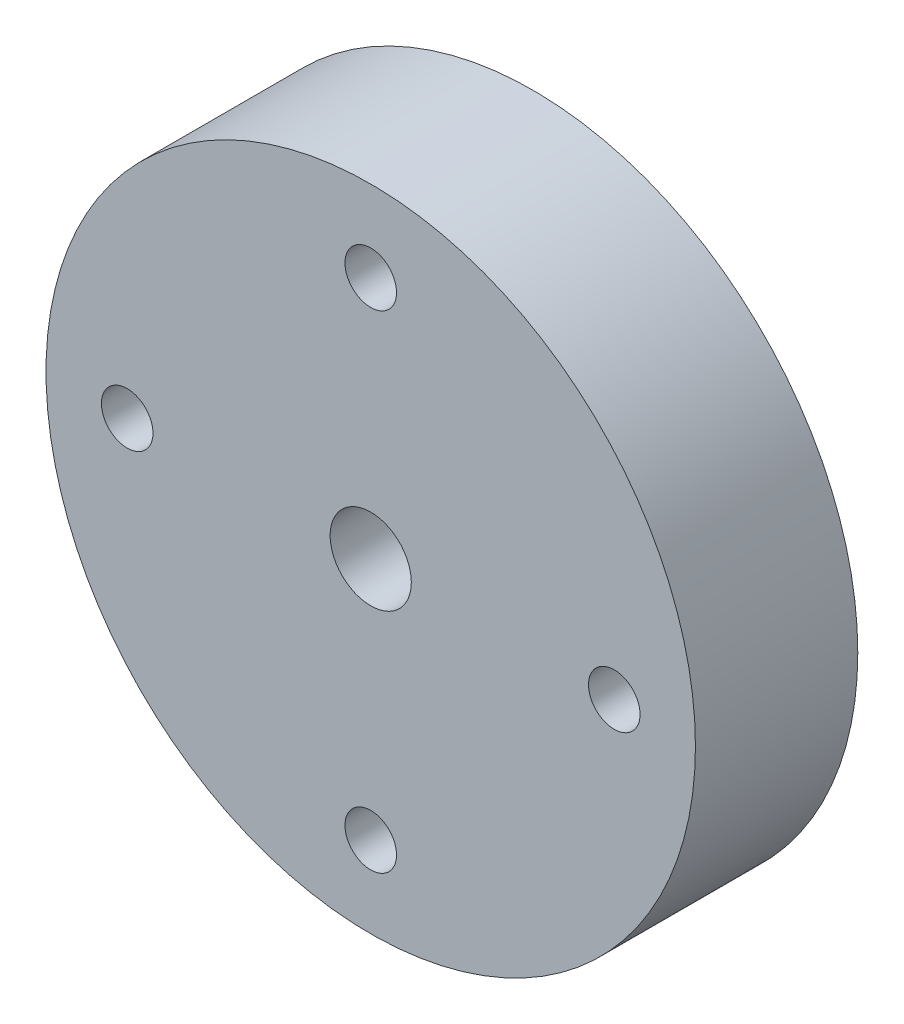
ISO-10303-21;
HEADER;
FILE_DESCRIPTION(('STEP AP214'),'2;1');
FILE_NAME('part.step','',(''),(''),'','','');
FILE_SCHEMA(('AUTOMOTIVE_DESIGN { 1 0 10303 214 1 1 1 1 }'));
ENDSEC;
DATA;
#1=APPLICATION_CONTEXT('core data for automotive mechanical design processes');
#2=APPLICATION_PROTOCOL_DEFINITION('international standard','automotive_design',2000,#1);
#3=PRODUCT_CONTEXT('',#1,'mechanical');
#4=PRODUCT('Part','Part','',(#3));
#5=PRODUCT_RELATED_PRODUCT_CATEGORY('part','',(#4));
#6=PRODUCT_DEFINITION_FORMATION('','',#4);
#7=PRODUCT_DEFINITION_CONTEXT('part definition',#1,'design');
#8=PRODUCT_DEFINITION('design','',#6,#7);
#9=PRODUCT_DEFINITION_SHAPE('','',#8);
#10=(LENGTH_UNIT() NAMED_UNIT(*) SI_UNIT(.MILLI.,.METRE.));
#11=(NAMED_UNIT(*) PLANE_ANGLE_UNIT() SI_UNIT($,.RADIAN.));
#12=(NAMED_UNIT(*) SI_UNIT($,.STERADIAN.) SOLID_ANGLE_UNIT());
#13=UNCERTAINTY_MEASURE_WITH_UNIT(LENGTH_MEASURE(1.E-05),#10,'distance_accuracy_value','');
#14=(GEOMETRIC_REPRESENTATION_CONTEXT(3) GLOBAL_UNCERTAINTY_ASSIGNED_CONTEXT((#13)) GLOBAL_UNIT_ASSIGNED_CONTEXT((#10,
#11,#12)) REPRESENTATION_CONTEXT('',''));
#15=CARTESIAN_POINT('',(0.,0.,0.));
#16=DIRECTION('',(0.,0.,1.));
#17=DIRECTION('',(1.,0.,0.));
#18=AXIS2_PLACEMENT_3D('',#15,#16,#17);
#19=CARTESIAN_POINT('',(0.,0.,10.));
#20=DIRECTION('',(0.,0.,1.));
#21=DIRECTION('',(1.,0.,0.));
#22=AXIS2_PLACEMENT_3D('',#19,#20,#21);
#23=PLANE('',#22);
#24=CARTESIAN_POINT('',(4.7686089134E-13,15.,10.));
#25=DIRECTION('',(0.,0.,1.));
#26=DIRECTION('',(1.,0.,0.));
#27=AXIS2_PLACEMENT_3D('',#24,#25,#26);
#28=CIRCLE('',#27,1.5875);
#29=CARTESIAN_POINT('',(1.58750000000048,15.,10.));
#30=VERTEX_POINT('',#29);
#31=EDGE_CURVE('E72',#30,#30,#28,.T.);
#32=ORIENTED_EDGE('',*,*,#31,.F.);
#33=EDGE_LOOP('',(#32));
#34=FACE_BOUND('',#33,.T.);
#35=CARTESIAN_POINT('',(15.0000000000005,0.,10.));
#36=DIRECTION('',(0.,0.,1.));
#37=DIRECTION('',(1.,0.,0.));
#38=AXIS2_PLACEMENT_3D('',#35,#36,#37);
#39=CIRCLE('',#38,1.5875);
#40=CARTESIAN_POINT('',(16.5875000000005,0.,10.));
#41=VERTEX_POINT('',#40);
#42=EDGE_CURVE('E66',#41,#41,#39,.T.);
#43=ORIENTED_EDGE('',*,*,#42,.F.);
#44=EDGE_LOOP('',(#43));
#45=FACE_BOUND('',#44,.T.);
#46=CARTESIAN_POINT('',(5.4154452563787E-13,-15.,10.));
#47=DIRECTION('',(0.,0.,1.));
#48=DIRECTION('',(1.,0.,0.));
#49=AXIS2_PLACEMENT_3D('',#46,#47,#48);
#50=CIRCLE('',#49,1.5875);
#51=CARTESIAN_POINT('',(1.58750000000054,-15.,10.));
#52=VERTEX_POINT('',#51);
#53=EDGE_CURVE('E60',#52,#52,#50,.T.);
#54=ORIENTED_EDGE('',*,*,#53,.F.);
#55=EDGE_LOOP('',(#54));
#56=FACE_BOUND('',#55,.T.);
#57=CARTESIAN_POINT('',(-14.9999999999995,0.,10.));
#58=DIRECTION('',(0.,0.,1.));
#59=DIRECTION('',(1.,0.,0.));
#60=AXIS2_PLACEMENT_3D('',#57,#58,#59);
#61=CIRCLE('',#60,1.5875);
#62=CARTESIAN_POINT('',(-13.4124999999995,0.,10.));
#63=VERTEX_POINT('',#62);
#64=EDGE_CURVE('E54',#63,#63,#61,.T.);
#65=ORIENTED_EDGE('',*,*,#64,.F.);
#66=EDGE_LOOP('',(#65));
#67=FACE_BOUND('',#66,.T.);
#68=CARTESIAN_POINT('',(0.,0.,10.));
#69=DIRECTION('',(0.,0.,1.));
#70=DIRECTION('',(1.,0.,0.));
#71=AXIS2_PLACEMENT_3D('',#68,#69,#70);
#72=CIRCLE('',#71,20.);
#73=CARTESIAN_POINT('',(20.,0.,10.));
#74=VERTEX_POINT('',#73);
#75=EDGE_CURVE('E10',#74,#74,#72,.T.);
#76=ORIENTED_EDGE('',*,*,#75,.T.);
#77=EDGE_LOOP('',(#76));
#78=FACE_BOUND('',#77,.T.);
#79=CARTESIAN_POINT('',(0.,0.,10.));
#80=DIRECTION('',(0.,0.,1.));
#81=DIRECTION('',(1.,0.,0.));
#82=AXIS2_PLACEMENT_3D('',#79,#80,#81);
#83=CIRCLE('',#82,2.5);
#84=CARTESIAN_POINT('',(2.5,0.,10.));
#85=VERTEX_POINT('',#84);
#86=EDGE_CURVE('E44',#85,#85,#83,.T.);
#87=ORIENTED_EDGE('',*,*,#86,.F.);
#88=EDGE_LOOP('',(#87));
#89=FACE_BOUND('',#88,.T.);
#90=ADVANCED_FACE('F33',(#34,#45,#56,#67,#78,#89),#23,.T.);
#91=CARTESIAN_POINT('',(0.,0.,0.));
#92=DIRECTION('',(0.,0.,1.));
#93=DIRECTION('',(1.,0.,0.));
#94=AXIS2_PLACEMENT_3D('',#91,#92,#93);
#95=PLANE('',#94);
#96=CARTESIAN_POINT('',(4.7686089134E-13,15.,0.));
#97=DIRECTION('',(0.,0.,1.));
#98=DIRECTION('',(1.,0.,0.));
#99=AXIS2_PLACEMENT_3D('',#96,#97,#98);
#100=CIRCLE('',#99,1.5875);
#101=CARTESIAN_POINT('',(1.58750000000048,15.,0.));
#102=VERTEX_POINT('',#101);
#103=EDGE_CURVE('E69',#102,#102,#100,.T.);
#104=ORIENTED_EDGE('',*,*,#103,.T.);
#105=EDGE_LOOP('',(#104));
#106=FACE_BOUND('',#105,.T.);
#107=CARTESIAN_POINT('',(15.0000000000005,0.,0.));
#108=DIRECTION('',(0.,0.,1.));
#109=DIRECTION('',(1.,0.,0.));
#110=AXIS2_PLACEMENT_3D('',#107,#108,#109);
#111=CIRCLE('',#110,1.5875);
#112=CARTESIAN_POINT('',(16.5875000000005,0.,0.));
#113=VERTEX_POINT('',#112);
#114=EDGE_CURVE('E63',#113,#113,#111,.T.);
#115=ORIENTED_EDGE('',*,*,#114,.T.);
#116=EDGE_LOOP('',(#115));
#117=FACE_BOUND('',#116,.T.);
#118=CARTESIAN_POINT('',(5.4154452563787E-13,-15.,0.));
#119=DIRECTION('',(0.,0.,1.));
#120=DIRECTION('',(1.,0.,0.));
#121=AXIS2_PLACEMENT_3D('',#118,#119,#120);
#122=CIRCLE('',#121,1.5875);
#123=CARTESIAN_POINT('',(1.58750000000054,-15.,0.));
#124=VERTEX_POINT('',#123);
#125=EDGE_CURVE('E57',#124,#124,#122,.T.);
#126=ORIENTED_EDGE('',*,*,#125,.T.);
#127=EDGE_LOOP('',(#126));
#128=FACE_BOUND('',#127,.T.);
#129=CARTESIAN_POINT('',(-14.9999999999995,0.,0.));
#130=DIRECTION('',(0.,0.,1.));
#131=DIRECTION('',(1.,0.,0.));
#132=AXIS2_PLACEMENT_3D('',#129,#130,#131);
#133=CIRCLE('',#132,1.5875);
#134=CARTESIAN_POINT('',(-13.4124999999995,0.,0.));
#135=VERTEX_POINT('',#134);
#136=EDGE_CURVE('E49',#135,#135,#133,.T.);
#137=ORIENTED_EDGE('',*,*,#136,.T.);
#138=EDGE_LOOP('',(#137));
#139=FACE_BOUND('',#138,.T.);
#140=CARTESIAN_POINT('',(0.,0.,0.));
#141=DIRECTION('',(0.,0.,1.));
#142=DIRECTION('',(1.,0.,0.));
#143=AXIS2_PLACEMENT_3D('',#140,#141,#142);
#144=CIRCLE('',#143,20.);
#145=CARTESIAN_POINT('',(20.,0.,0.));
#146=VERTEX_POINT('',#145);
#147=EDGE_CURVE('E37',#146,#146,#144,.T.);
#148=ORIENTED_EDGE('',*,*,#147,.F.);
#149=EDGE_LOOP('',(#148));
#150=FACE_BOUND('',#149,.T.);
#151=CARTESIAN_POINT('',(0.,0.,0.));
#152=DIRECTION('',(0.,0.,1.));
#153=DIRECTION('',(1.,0.,0.));
#154=AXIS2_PLACEMENT_3D('',#151,#152,#153);
#155=CIRCLE('',#154,2.5);
#156=CARTESIAN_POINT('',(2.5,0.,0.));
#157=VERTEX_POINT('',#156);
#158=EDGE_CURVE('E46',#157,#157,#155,.T.);
#159=ORIENTED_EDGE('',*,*,#158,.T.);
#160=EDGE_LOOP('',(#159));
#161=FACE_BOUND('',#160,.T.);
#162=ADVANCED_FACE('F80',(#106,#117,#128,#139,#150,#161),#95,.F.);
#163=CARTESIAN_POINT('',(0.,0.,10.));
#164=DIRECTION('',(0.,0.,-1.));
#165=DIRECTION('',(-1.,0.,0.));
#166=AXIS2_PLACEMENT_3D('',#163,#164,#165);
#167=CYLINDRICAL_SURFACE('',#166,20.);
#168=ORIENTED_EDGE('',*,*,#75,.F.);
#169=EDGE_LOOP('',(#168));
#170=FACE_BOUND('',#169,.T.);
#171=ORIENTED_EDGE('',*,*,#147,.T.);
#172=EDGE_LOOP('',(#171));
#173=FACE_BOUND('',#172,.T.);
#174=ADVANCED_FACE('F35',(#170,#173),#167,.T.);
#175=CARTESIAN_POINT('',(0.,0.,10.));
#176=DIRECTION('',(0.,0.,-1.));
#177=DIRECTION('',(-1.,0.,0.));
#178=AXIS2_PLACEMENT_3D('',#175,#176,#177);
#179=CYLINDRICAL_SURFACE('',#178,2.5);
#180=ORIENTED_EDGE('',*,*,#86,.T.);
#181=EDGE_LOOP('',(#180));
#182=FACE_BOUND('',#181,.T.);
#183=ORIENTED_EDGE('',*,*,#158,.F.);
#184=EDGE_LOOP('',(#183));
#185=FACE_BOUND('',#184,.T.);
#186=ADVANCED_FACE('F90',(#182,#185),#179,.F.);
#187=CARTESIAN_POINT('',(-14.9999999999995,0.,10.));
#188=DIRECTION('',(0.,0.,1.));
#189=DIRECTION('',(1.,0.,0.));
#190=AXIS2_PLACEMENT_3D('',#187,#188,#189);
#191=CYLINDRICAL_SURFACE('',#190,1.5875);
#192=ORIENTED_EDGE('',*,*,#136,.F.);
#193=EDGE_LOOP('',(#192));
#194=FACE_BOUND('',#193,.T.);
#195=ORIENTED_EDGE('',*,*,#64,.T.);
#196=EDGE_LOOP('',(#195));
#197=FACE_BOUND('',#196,.T.);
#198=ADVANCED_FACE('F93',(#194,#197),#191,.F.);
#199=CARTESIAN_POINT('',(5.4154452563787E-13,-15.,10.));
#200=DIRECTION('',(0.,0.,1.));
#201=DIRECTION('',(1.,0.,0.));
#202=AXIS2_PLACEMENT_3D('',#199,#200,#201);
#203=CYLINDRICAL_SURFACE('',#202,1.5875);
#204=ORIENTED_EDGE('',*,*,#125,.F.);
#205=EDGE_LOOP('',(#204));
#206=FACE_BOUND('',#205,.T.);
#207=ORIENTED_EDGE('',*,*,#53,.T.);
#208=EDGE_LOOP('',(#207));
#209=FACE_BOUND('',#208,.T.);
#210=ADVANCED_FACE('F107',(#206,#209),#203,.F.);
#211=CARTESIAN_POINT('',(15.0000000000005,0.,10.));
#212=DIRECTION('',(0.,0.,1.));
#213=DIRECTION('',(1.,0.,0.));
#214=AXIS2_PLACEMENT_3D('',#211,#212,#213);
#215=CYLINDRICAL_SURFACE('',#214,1.5875);
#216=ORIENTED_EDGE('',*,*,#114,.F.);
#217=EDGE_LOOP('',(#216));
#218=FACE_BOUND('',#217,.T.);
#219=ORIENTED_EDGE('',*,*,#42,.T.);
#220=EDGE_LOOP('',(#219));
#221=FACE_BOUND('',#220,.T.);
#222=ADVANCED_FACE('F111',(#218,#221),#215,.F.);
#223=CARTESIAN_POINT('',(4.7686089134E-13,15.,10.));
#224=DIRECTION('',(0.,0.,1.));
#225=DIRECTION('',(1.,0.,0.));
#226=AXIS2_PLACEMENT_3D('',#223,#224,#225);
#227=CYLINDRICAL_SURFACE('',#226,1.5875);
#228=ORIENTED_EDGE('',*,*,#103,.F.);
#229=EDGE_LOOP('',(#228));
#230=FACE_BOUND('',#229,.T.);
#231=ORIENTED_EDGE('',*,*,#31,.T.);
#232=EDGE_LOOP('',(#231));
#233=FACE_BOUND('',#232,.T.);
#234=ADVANCED_FACE('F76',(#230,#233),#227,.F.);
#235=CLOSED_SHELL('',(#90,#162,#174,#186,#198,#210,#222,#234));
#236=MANIFOLD_SOLID_BREP('B2',#235);
#237=ADVANCED_BREP_SHAPE_REPRESENTATION('',(#18,#236),#14);
#238=SHAPE_DEFINITION_REPRESENTATION(#9,#237);
ENDSEC;
END-ISO-10303-21;
